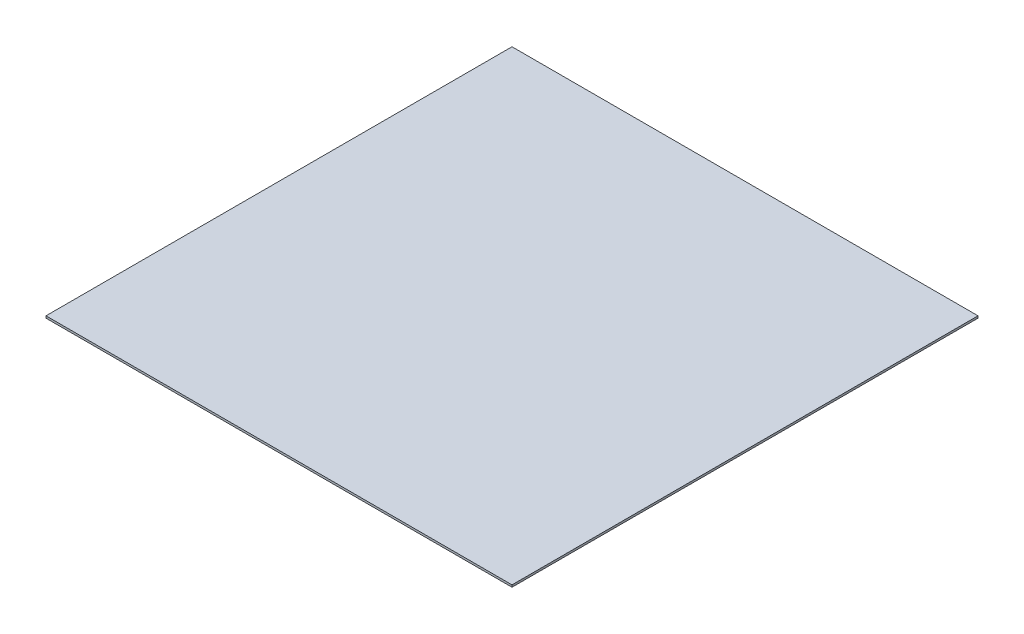
ISO-10303-21;
HEADER;
FILE_DESCRIPTION(('STEP AP214'),'2;1');
FILE_NAME('part.step','',(''),(''),'','','');
FILE_SCHEMA(('AUTOMOTIVE_DESIGN { 1 0 10303 214 1 1 1 1 }'));
ENDSEC;
DATA;
#1=APPLICATION_CONTEXT('core data for automotive mechanical design processes');
#2=APPLICATION_PROTOCOL_DEFINITION('international standard','automotive_design',2000,#1);
#3=PRODUCT_CONTEXT('',#1,'mechanical');
#4=PRODUCT('Part','Part','',(#3));
#5=PRODUCT_RELATED_PRODUCT_CATEGORY('part','',(#4));
#6=PRODUCT_DEFINITION_FORMATION('','',#4);
#7=PRODUCT_DEFINITION_CONTEXT('part definition',#1,'design');
#8=PRODUCT_DEFINITION('design','',#6,#7);
#9=PRODUCT_DEFINITION_SHAPE('','',#8);
#10=(LENGTH_UNIT() NAMED_UNIT(*) SI_UNIT(.MILLI.,.METRE.));
#11=(NAMED_UNIT(*) PLANE_ANGLE_UNIT() SI_UNIT($,.RADIAN.));
#12=(NAMED_UNIT(*) SI_UNIT($,.STERADIAN.) SOLID_ANGLE_UNIT());
#13=UNCERTAINTY_MEASURE_WITH_UNIT(LENGTH_MEASURE(1.E-05),#10,'distance_accuracy_value','');
#14=(GEOMETRIC_REPRESENTATION_CONTEXT(3) GLOBAL_UNCERTAINTY_ASSIGNED_CONTEXT((#13)) GLOBAL_UNIT_ASSIGNED_CONTEXT((#10,
#11,#12)) REPRESENTATION_CONTEXT('',''));
#15=CARTESIAN_POINT('',(0.,0.,0.));
#16=DIRECTION('',(0.,0.,1.));
#17=DIRECTION('',(1.,0.,0.));
#18=AXIS2_PLACEMENT_3D('',#15,#16,#17);
#19=CARTESIAN_POINT('',(337.734645702247,3.175,-267.199768653992));
#20=DIRECTION('',(1.,0.,0.));
#21=DIRECTION('',(0.,0.,-1.));
#22=AXIS2_PLACEMENT_3D('',#19,#20,#21);
#23=PLANE('',#22);
#24=DIRECTION('',(0.,0.,1.));
#25=VECTOR('',#24,1.);
#26=CARTESIAN_POINT('',(337.734645702247,0.,-267.199768653992));
#27=LINE('',#26,#25);
#28=CARTESIAN_POINT('',(337.734645702247,0.,-267.199768653992));
#29=VERTEX_POINT('',#28);
#30=CARTESIAN_POINT('',(337.734645702247,0.,444.000231346008));
#31=VERTEX_POINT('',#30);
#32=EDGE_CURVE('E96',#29,#31,#27,.T.);
#33=ORIENTED_EDGE('',*,*,#32,.T.);
#34=DIRECTION('',(0.,-1.,0.));
#35=VECTOR('',#34,1.);
#36=CARTESIAN_POINT('',(337.734645702247,3.175,444.000231346008));
#37=LINE('',#36,#35);
#38=CARTESIAN_POINT('',(337.734645702247,3.175,444.000231346008));
#39=VERTEX_POINT('',#38);
#40=EDGE_CURVE('E11',#39,#31,#37,.T.);
#41=ORIENTED_EDGE('',*,*,#40,.F.);
#42=DIRECTION('',(0.,0.,1.));
#43=VECTOR('',#42,1.);
#44=CARTESIAN_POINT('',(337.734645702247,3.175,-267.199768653992));
#45=LINE('',#44,#43);
#46=CARTESIAN_POINT('',(337.734645702247,3.175,-267.199768653992));
#47=VERTEX_POINT('',#46);
#48=EDGE_CURVE('E84',#47,#39,#45,.T.);
#49=ORIENTED_EDGE('',*,*,#48,.F.);
#50=DIRECTION('',(0.,-1.,0.));
#51=VECTOR('',#50,1.);
#52=CARTESIAN_POINT('',(337.734645702247,3.175,-267.199768653992));
#53=LINE('',#52,#51);
#54=EDGE_CURVE('E92',#47,#29,#53,.T.);
#55=ORIENTED_EDGE('',*,*,#54,.T.);
#56=EDGE_LOOP('',(#33,#41,#49,#55));
#57=FACE_BOUND('',#56,.T.);
#58=ADVANCED_FACE('F33',(#57),#23,.F.);
#59=CARTESIAN_POINT('',(337.734645702247,3.175,444.000231346008));
#60=DIRECTION('',(0.,0.,-1.));
#61=DIRECTION('',(-1.,0.,0.));
#62=AXIS2_PLACEMENT_3D('',#59,#60,#61);
#63=PLANE('',#62);
#64=DIRECTION('',(1.,0.,0.));
#65=VECTOR('',#64,1.);
#66=CARTESIAN_POINT('',(337.734645702247,0.,444.000231346008));
#67=LINE('',#66,#65);
#68=CARTESIAN_POINT('',(1048.93464570225,0.,444.000231346008));
#69=VERTEX_POINT('',#68);
#70=EDGE_CURVE('E88',#31,#69,#67,.T.);
#71=ORIENTED_EDGE('',*,*,#70,.T.);
#72=DIRECTION('',(0.,-1.,0.));
#73=VECTOR('',#72,1.);
#74=CARTESIAN_POINT('',(1048.93464570225,3.175,444.000231346008));
#75=LINE('',#74,#73);
#76=CARTESIAN_POINT('',(1048.93464570225,3.175,444.000231346008));
#77=VERTEX_POINT('',#76);
#78=EDGE_CURVE('E41',#77,#69,#75,.T.);
#79=ORIENTED_EDGE('',*,*,#78,.F.);
#80=DIRECTION('',(1.,0.,0.));
#81=VECTOR('',#80,1.);
#82=CARTESIAN_POINT('',(337.734645702247,3.175,444.000231346008));
#83=LINE('',#82,#81);
#84=EDGE_CURVE('E79',#39,#77,#83,.T.);
#85=ORIENTED_EDGE('',*,*,#84,.F.);
#86=ORIENTED_EDGE('',*,*,#40,.T.);
#87=EDGE_LOOP('',(#71,#79,#85,#86));
#88=FACE_BOUND('',#87,.T.);
#89=ADVANCED_FACE('F87',(#88),#63,.F.);
#90=CARTESIAN_POINT('',(1048.93464570225,3.175,-267.199768653992));
#91=DIRECTION('',(-1.,0.,0.));
#92=DIRECTION('',(0.,0.,1.));
#93=AXIS2_PLACEMENT_3D('',#90,#91,#92);
#94=PLANE('',#93);
#95=DIRECTION('',(0.,0.,-1.));
#96=VECTOR('',#95,1.);
#97=CARTESIAN_POINT('',(1048.93464570225,0.,-267.199768653992));
#98=LINE('',#97,#96);
#99=CARTESIAN_POINT('',(1048.93464570225,0.,-267.199768653992));
#100=VERTEX_POINT('',#99);
#101=EDGE_CURVE('E66',#69,#100,#98,.T.);
#102=ORIENTED_EDGE('',*,*,#101,.T.);
#103=DIRECTION('',(0.,-1.,0.));
#104=VECTOR('',#103,1.);
#105=CARTESIAN_POINT('',(1048.93464570225,3.175,-267.199768653992));
#106=LINE('',#105,#104);
#107=CARTESIAN_POINT('',(1048.93464570225,3.175,-267.199768653992));
#108=VERTEX_POINT('',#107);
#109=EDGE_CURVE('E89',#108,#100,#106,.T.);
#110=ORIENTED_EDGE('',*,*,#109,.F.);
#111=DIRECTION('',(0.,0.,-1.));
#112=VECTOR('',#111,1.);
#113=CARTESIAN_POINT('',(1048.93464570225,3.175,-267.199768653992));
#114=LINE('',#113,#112);
#115=EDGE_CURVE('E82',#77,#108,#114,.T.);
#116=ORIENTED_EDGE('',*,*,#115,.F.);
#117=ORIENTED_EDGE('',*,*,#78,.T.);
#118=EDGE_LOOP('',(#102,#110,#116,#117));
#119=FACE_BOUND('',#118,.T.);
#120=ADVANCED_FACE('F90',(#119),#94,.F.);
#121=CARTESIAN_POINT('',(337.734645702247,3.175,-267.199768653992));
#122=DIRECTION('',(0.,0.,1.));
#123=DIRECTION('',(1.,0.,0.));
#124=AXIS2_PLACEMENT_3D('',#121,#122,#123);
#125=PLANE('',#124);
#126=DIRECTION('',(-1.,0.,0.));
#127=VECTOR('',#126,1.);
#128=CARTESIAN_POINT('',(337.734645702247,0.,-267.199768653992));
#129=LINE('',#128,#127);
#130=EDGE_CURVE('E72',#100,#29,#129,.T.);
#131=ORIENTED_EDGE('',*,*,#130,.T.);
#132=ORIENTED_EDGE('',*,*,#54,.F.);
#133=DIRECTION('',(-1.,0.,0.));
#134=VECTOR('',#133,1.);
#135=CARTESIAN_POINT('',(337.734645702247,3.175,-267.199768653992));
#136=LINE('',#135,#134);
#137=EDGE_CURVE('E49',#108,#47,#136,.T.);
#138=ORIENTED_EDGE('',*,*,#137,.F.);
#139=ORIENTED_EDGE('',*,*,#109,.T.);
#140=EDGE_LOOP('',(#131,#132,#138,#139));
#141=FACE_BOUND('',#140,.T.);
#142=ADVANCED_FACE('F103',(#141),#125,.F.);
#143=CARTESIAN_POINT('',(0.,3.175,0.));
#144=DIRECTION('',(0.,1.,0.));
#145=DIRECTION('',(0.,0.,1.));
#146=AXIS2_PLACEMENT_3D('',#143,#144,#145);
#147=PLANE('',#146);
#148=ORIENTED_EDGE('',*,*,#48,.T.);
#149=ORIENTED_EDGE('',*,*,#84,.T.);
#150=ORIENTED_EDGE('',*,*,#115,.T.);
#151=ORIENTED_EDGE('',*,*,#137,.T.);
#152=EDGE_LOOP('',(#148,#149,#150,#151));
#153=FACE_BOUND('',#152,.T.);
#154=ADVANCED_FACE('F80',(#153),#147,.T.);
#155=CARTESIAN_POINT('',(0.,0.,0.));
#156=DIRECTION('',(0.,1.,0.));
#157=DIRECTION('',(0.,0.,1.));
#158=AXIS2_PLACEMENT_3D('',#155,#156,#157);
#159=PLANE('',#158);
#160=ORIENTED_EDGE('',*,*,#32,.F.);
#161=ORIENTED_EDGE('',*,*,#130,.F.);
#162=ORIENTED_EDGE('',*,*,#101,.F.);
#163=ORIENTED_EDGE('',*,*,#70,.F.);
#164=EDGE_LOOP('',(#160,#161,#162,#163));
#165=FACE_BOUND('',#164,.T.);
#166=ADVANCED_FACE('F106',(#165),#159,.F.);
#167=CLOSED_SHELL('',(#58,#89,#120,#142,#154,#166));
#168=MANIFOLD_SOLID_BREP('B2',#167);
#169=ADVANCED_BREP_SHAPE_REPRESENTATION('',(#18,#168),#14);
#170=SHAPE_DEFINITION_REPRESENTATION(#9,#169);
ENDSEC;
END-ISO-10303-21;
